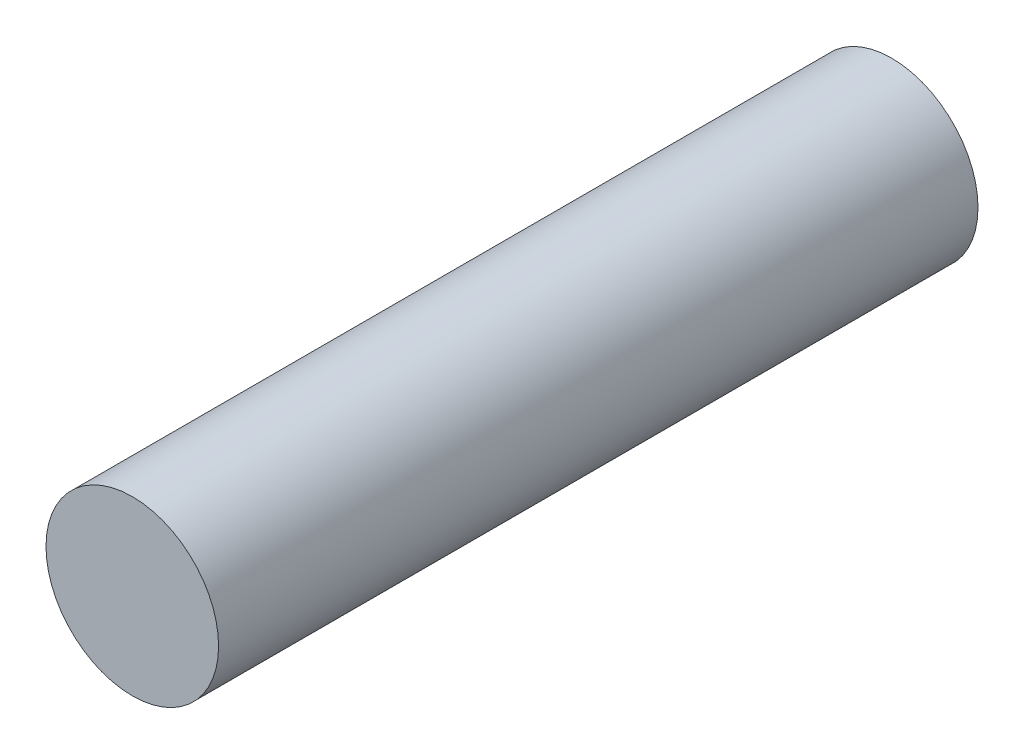
ISO-10303-21;
HEADER;
FILE_DESCRIPTION(('STEP AP214'),'2;1');
FILE_NAME('part.step','',(''),(''),'','','');
FILE_SCHEMA(('AUTOMOTIVE_DESIGN { 1 0 10303 214 1 1 1 1 }'));
ENDSEC;
DATA;
#1=APPLICATION_CONTEXT('core data for automotive mechanical design processes');
#2=APPLICATION_PROTOCOL_DEFINITION('international standard','automotive_design',2000,#1);
#3=PRODUCT_CONTEXT('',#1,'mechanical');
#4=PRODUCT('Part','Part','',(#3));
#5=PRODUCT_RELATED_PRODUCT_CATEGORY('part','',(#4));
#6=PRODUCT_DEFINITION_FORMATION('','',#4);
#7=PRODUCT_DEFINITION_CONTEXT('part definition',#1,'design');
#8=PRODUCT_DEFINITION('design','',#6,#7);
#9=PRODUCT_DEFINITION_SHAPE('','',#8);
#10=(LENGTH_UNIT() NAMED_UNIT(*) SI_UNIT(.MILLI.,.METRE.));
#11=(NAMED_UNIT(*) PLANE_ANGLE_UNIT() SI_UNIT($,.RADIAN.));
#12=(NAMED_UNIT(*) SI_UNIT($,.STERADIAN.) SOLID_ANGLE_UNIT());
#13=UNCERTAINTY_MEASURE_WITH_UNIT(LENGTH_MEASURE(1.E-05),#10,'distance_accuracy_value','');
#14=(GEOMETRIC_REPRESENTATION_CONTEXT(3) GLOBAL_UNCERTAINTY_ASSIGNED_CONTEXT((#13)) GLOBAL_UNIT_ASSIGNED_CONTEXT((#10,
#11,#12)) REPRESENTATION_CONTEXT('',''));
#15=CARTESIAN_POINT('',(0.,0.,0.));
#16=DIRECTION('',(0.,0.,1.));
#17=DIRECTION('',(1.,0.,0.));
#18=AXIS2_PLACEMENT_3D('',#15,#16,#17);
#19=CARTESIAN_POINT('',(0.,0.,0.));
#20=DIRECTION('',(0.,0.,-1.));
#21=DIRECTION('',(-1.,0.,0.));
#22=AXIS2_PLACEMENT_3D('',#19,#20,#21);
#23=PLANE('',#22);
#24=CARTESIAN_POINT('',(0.,0.,0.));
#25=DIRECTION('',(0.,0.,-1.));
#26=DIRECTION('',(-1.,0.,0.));
#27=AXIS2_PLACEMENT_3D('',#24,#25,#26);
#28=CIRCLE('',#27,3.96875);
#29=CARTESIAN_POINT('',(-3.96875,0.,0.));
#30=VERTEX_POINT('',#29);
#31=EDGE_CURVE('E10',#30,#30,#28,.T.);
#32=ORIENTED_EDGE('',*,*,#31,.F.);
#33=EDGE_LOOP('',(#32));
#34=FACE_BOUND('',#33,.T.);
#35=ADVANCED_FACE('F33',(#34),#23,.F.);
#36=CARTESIAN_POINT('',(0.,0.,0.));
#37=DIRECTION('',(0.,0.,-1.));
#38=DIRECTION('',(-1.,0.,0.));
#39=AXIS2_PLACEMENT_3D('',#36,#37,#38);
#40=CYLINDRICAL_SURFACE('',#39,3.96875);
#41=CARTESIAN_POINT('',(0.,0.,-34.925));
#42=DIRECTION('',(0.,0.,-1.));
#43=DIRECTION('',(-1.,0.,0.));
#44=AXIS2_PLACEMENT_3D('',#41,#42,#43);
#45=CIRCLE('',#44,3.96875);
#46=CARTESIAN_POINT('',(-3.96875,0.,-34.925));
#47=VERTEX_POINT('',#46);
#48=EDGE_CURVE('E39',#47,#47,#45,.T.);
#49=ORIENTED_EDGE('',*,*,#48,.F.);
#50=EDGE_LOOP('',(#49));
#51=FACE_BOUND('',#50,.T.);
#52=ORIENTED_EDGE('',*,*,#31,.T.);
#53=EDGE_LOOP('',(#52));
#54=FACE_BOUND('',#53,.T.);
#55=ADVANCED_FACE('F47',(#51,#54),#40,.T.);
#56=CARTESIAN_POINT('',(0.,0.,-34.925));
#57=DIRECTION('',(0.,0.,1.));
#58=DIRECTION('',(1.,0.,0.));
#59=AXIS2_PLACEMENT_3D('',#56,#57,#58);
#60=PLANE('',#59);
#61=ORIENTED_EDGE('',*,*,#48,.T.);
#62=EDGE_LOOP('',(#61));
#63=FACE_BOUND('',#62,.T.);
#64=ADVANCED_FACE('F45',(#63),#60,.F.);
#65=CLOSED_SHELL('',(#35,#55,#64));
#66=MANIFOLD_SOLID_BREP('B2',#65);
#67=ADVANCED_BREP_SHAPE_REPRESENTATION('',(#18,#66),#14);
#68=SHAPE_DEFINITION_REPRESENTATION(#9,#67);
ENDSEC;
END-ISO-10303-21;
